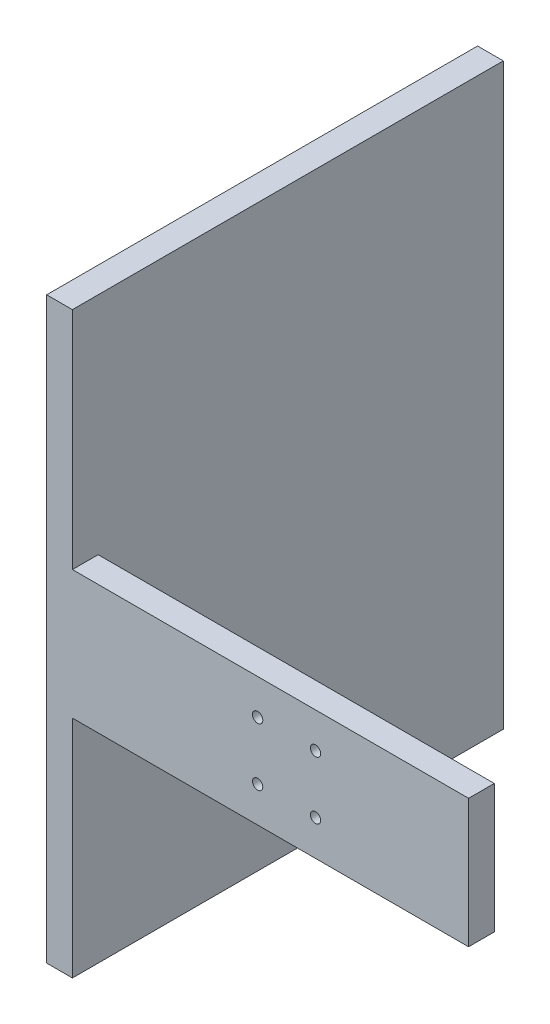
ISO-10303-21;
HEADER;
FILE_DESCRIPTION(('STEP AP214'),'2;1');
FILE_NAME('part.step','',(''),(''),'','','');
FILE_SCHEMA(('AUTOMOTIVE_DESIGN { 1 0 10303 214 1 1 1 1 }'));
ENDSEC;
DATA;
#1=APPLICATION_CONTEXT('core data for automotive mechanical design processes');
#2=APPLICATION_PROTOCOL_DEFINITION('international standard','automotive_design',2000,#1);
#3=PRODUCT_CONTEXT('',#1,'mechanical');
#4=PRODUCT('Part','Part','',(#3));
#5=PRODUCT_RELATED_PRODUCT_CATEGORY('part','',(#4));
#6=PRODUCT_DEFINITION_FORMATION('','',#4);
#7=PRODUCT_DEFINITION_CONTEXT('part definition',#1,'design');
#8=PRODUCT_DEFINITION('design','',#6,#7);
#9=PRODUCT_DEFINITION_SHAPE('','',#8);
#10=(LENGTH_UNIT() NAMED_UNIT(*) SI_UNIT(.MILLI.,.METRE.));
#11=(NAMED_UNIT(*) PLANE_ANGLE_UNIT() SI_UNIT($,.RADIAN.));
#12=(NAMED_UNIT(*) SI_UNIT($,.STERADIAN.) SOLID_ANGLE_UNIT());
#13=UNCERTAINTY_MEASURE_WITH_UNIT(LENGTH_MEASURE(1.E-05),#10,'distance_accuracy_value','');
#14=(GEOMETRIC_REPRESENTATION_CONTEXT(3) GLOBAL_UNCERTAINTY_ASSIGNED_CONTEXT((#13)) GLOBAL_UNIT_ASSIGNED_CONTEXT((#10,
#11,#12)) REPRESENTATION_CONTEXT('',''));
#15=CARTESIAN_POINT('',(0.,0.,0.));
#16=DIRECTION('',(0.,0.,1.));
#17=DIRECTION('',(1.,0.,0.));
#18=AXIS2_PLACEMENT_3D('',#15,#16,#17);
#19=CARTESIAN_POINT('',(-151.1,-10.,32.));
#20=DIRECTION('',(0.,1.,0.));
#21=DIRECTION('',(0.,0.,1.));
#22=AXIS2_PLACEMENT_3D('',#19,#20,#21);
#23=PLANE('',#22);
#24=DIRECTION('',(0.,0.,1.));
#25=VECTOR('',#24,1.);
#26=CARTESIAN_POINT('',(-147.1,-10.,32.));
#27=LINE('',#26,#25);
#28=CARTESIAN_POINT('',(-147.1,-10.,28.));
#29=VERTEX_POINT('',#28);
#30=CARTESIAN_POINT('',(-147.1,-10.,32.));
#31=VERTEX_POINT('',#30);
#32=EDGE_CURVE('E114',#29,#31,#27,.T.);
#33=ORIENTED_EDGE('',*,*,#32,.F.);
#34=DIRECTION('',(1.,0.,0.));
#35=VECTOR('',#34,1.);
#36=CARTESIAN_POINT('',(-151.1,-10.,28.));
#37=LINE('',#36,#35);
#38=CARTESIAN_POINT('',(-85.5,-10.,28.));
#39=VERTEX_POINT('',#38);
#40=EDGE_CURVE('E68',#29,#39,#37,.T.);
#41=ORIENTED_EDGE('',*,*,#40,.T.);
#42=DIRECTION('',(0.,0.,-1.));
#43=VECTOR('',#42,1.);
#44=CARTESIAN_POINT('',(-85.5,-10.,32.));
#45=LINE('',#44,#43);
#46=CARTESIAN_POINT('',(-85.5,-10.,32.));
#47=VERTEX_POINT('',#46);
#48=EDGE_CURVE('E49',#47,#39,#45,.T.);
#49=ORIENTED_EDGE('',*,*,#48,.F.);
#50=DIRECTION('',(1.,0.,0.));
#51=VECTOR('',#50,1.);
#52=CARTESIAN_POINT('',(-151.1,-10.,32.));
#53=LINE('',#52,#51);
#54=EDGE_CURVE('E148',#31,#47,#53,.T.);
#55=ORIENTED_EDGE('',*,*,#54,.F.);
#56=EDGE_LOOP('',(#33,#41,#49,#55));
#57=FACE_BOUND('',#56,.T.);
#58=ADVANCED_FACE('F39',(#57),#23,.F.);
#59=CARTESIAN_POINT('',(-151.1,10.,32.));
#60=DIRECTION('',(0.,-1.,0.));
#61=DIRECTION('',(0.,0.,-1.));
#62=AXIS2_PLACEMENT_3D('',#59,#60,#61);
#63=PLANE('',#62);
#64=DIRECTION('',(0.,0.,-1.));
#65=VECTOR('',#64,1.);
#66=CARTESIAN_POINT('',(-147.1,10.,32.));
#67=LINE('',#66,#65);
#68=CARTESIAN_POINT('',(-147.1,9.99999999999999,32.));
#69=VERTEX_POINT('',#68);
#70=CARTESIAN_POINT('',(-147.1,10.,28.));
#71=VERTEX_POINT('',#70);
#72=EDGE_CURVE('E77',#69,#71,#67,.T.);
#73=ORIENTED_EDGE('',*,*,#72,.F.);
#74=DIRECTION('',(-1.,0.,0.));
#75=VECTOR('',#74,1.);
#76=CARTESIAN_POINT('',(-151.1,10.,32.));
#77=LINE('',#76,#75);
#78=CARTESIAN_POINT('',(-85.5,10.,32.));
#79=VERTEX_POINT('',#78);
#80=EDGE_CURVE('E154',#79,#69,#77,.T.);
#81=ORIENTED_EDGE('',*,*,#80,.F.);
#82=DIRECTION('',(0.,0.,-1.));
#83=VECTOR('',#82,1.);
#84=CARTESIAN_POINT('',(-85.5,10.,32.));
#85=LINE('',#84,#83);
#86=CARTESIAN_POINT('',(-85.5,10.,28.));
#87=VERTEX_POINT('',#86);
#88=EDGE_CURVE('E157',#79,#87,#85,.T.);
#89=ORIENTED_EDGE('',*,*,#88,.T.);
#90=DIRECTION('',(-1.,0.,0.));
#91=VECTOR('',#90,1.);
#92=CARTESIAN_POINT('',(-151.1,10.,28.));
#93=LINE('',#92,#91);
#94=EDGE_CURVE('E149',#87,#71,#93,.T.);
#95=ORIENTED_EDGE('',*,*,#94,.T.);
#96=EDGE_LOOP('',(#73,#81,#89,#95));
#97=FACE_BOUND('',#96,.T.);
#98=ADVANCED_FACE('F176',(#97),#63,.F.);
#99=CARTESIAN_POINT('',(0.,0.,28.));
#100=DIRECTION('',(0.,0.,-1.));
#101=DIRECTION('',(-1.,0.,0.));
#102=AXIS2_PLACEMENT_3D('',#99,#100,#101);
#103=PLANE('',#102);
#104=CARTESIAN_POINT('',(-109.3,-4.5,28.));
#105=DIRECTION('',(0.,0.,1.));
#106=DIRECTION('',(1.,0.,0.));
#107=AXIS2_PLACEMENT_3D('',#104,#105,#106);
#108=CIRCLE('',#107,0.799999999999995);
#109=CARTESIAN_POINT('',(-108.5,-4.5,28.));
#110=VERTEX_POINT('',#109);
#111=EDGE_CURVE('E264',#110,#110,#108,.T.);
#112=ORIENTED_EDGE('',*,*,#111,.T.);
#113=EDGE_LOOP('',(#112));
#114=FACE_BOUND('',#113,.T.);
#115=CARTESIAN_POINT('',(-118.3,4.5,28.));
#116=DIRECTION('',(0.,0.,1.));
#117=DIRECTION('',(1.,0.,0.));
#118=AXIS2_PLACEMENT_3D('',#115,#116,#117);
#119=CIRCLE('',#118,0.799999999999995);
#120=CARTESIAN_POINT('',(-117.5,4.5,28.));
#121=VERTEX_POINT('',#120);
#122=EDGE_CURVE('E258',#121,#121,#119,.T.);
#123=ORIENTED_EDGE('',*,*,#122,.T.);
#124=EDGE_LOOP('',(#123));
#125=FACE_BOUND('',#124,.T.);
#126=CARTESIAN_POINT('',(-118.3,-4.5,28.));
#127=DIRECTION('',(0.,0.,1.));
#128=DIRECTION('',(1.,0.,0.));
#129=AXIS2_PLACEMENT_3D('',#126,#127,#128);
#130=CIRCLE('',#129,0.799999999999995);
#131=CARTESIAN_POINT('',(-117.5,-4.5,28.));
#132=VERTEX_POINT('',#131);
#133=EDGE_CURVE('E270',#132,#132,#130,.T.);
#134=ORIENTED_EDGE('',*,*,#133,.T.);
#135=EDGE_LOOP('',(#134));
#136=FACE_BOUND('',#135,.T.);
#137=CARTESIAN_POINT('',(-109.3,4.5,28.));
#138=DIRECTION('',(0.,0.,1.));
#139=DIRECTION('',(1.,0.,0.));
#140=AXIS2_PLACEMENT_3D('',#137,#138,#139);
#141=CIRCLE('',#140,0.799999999999995);
#142=CARTESIAN_POINT('',(-108.5,4.5,28.));
#143=VERTEX_POINT('',#142);
#144=EDGE_CURVE('E183',#143,#143,#141,.T.);
#145=ORIENTED_EDGE('',*,*,#144,.T.);
#146=EDGE_LOOP('',(#145));
#147=FACE_BOUND('',#146,.T.);
#148=ORIENTED_EDGE('',*,*,#40,.F.);
#149=DIRECTION('',(0.,1.,0.));
#150=VECTOR('',#149,1.);
#151=CARTESIAN_POINT('',(-147.1,0.,28.));
#152=LINE('',#151,#150);
#153=EDGE_CURVE('E11',#29,#71,#152,.T.);
#154=ORIENTED_EDGE('',*,*,#153,.T.);
#155=ORIENTED_EDGE('',*,*,#94,.F.);
#156=DIRECTION('',(0.,1.,0.));
#157=VECTOR('',#156,1.);
#158=CARTESIAN_POINT('',(-85.5,-10.,28.));
#159=LINE('',#158,#157);
#160=EDGE_CURVE('E160',#39,#87,#159,.T.);
#161=ORIENTED_EDGE('',*,*,#160,.F.);
#162=EDGE_LOOP('',(#148,#154,#155,#161));
#163=FACE_BOUND('',#162,.T.);
#164=ADVANCED_FACE('F174',(#114,#125,#136,#147,#163),#103,.T.);
#165=CARTESIAN_POINT('',(-151.1,-10.,32.));
#166=DIRECTION('',(1.,0.,0.));
#167=DIRECTION('',(0.,0.,-1.));
#168=AXIS2_PLACEMENT_3D('',#165,#166,#167);
#169=PLANE('',#168);
#170=CARTESIAN_POINT('',(-151.1,-30.,15.));
#171=DIRECTION('',(1.,0.,0.));
#172=DIRECTION('',(0.,0.,-1.));
#173=AXIS2_PLACEMENT_3D('',#170,#171,#172);
#174=CIRCLE('',#173,0.8);
#175=CARTESIAN_POINT('',(-151.1,-30.,14.2));
#176=VERTEX_POINT('',#175);
#177=EDGE_CURVE('E294',#176,#176,#174,.T.);
#178=ORIENTED_EDGE('',*,*,#177,.T.);
#179=EDGE_LOOP('',(#178));
#180=FACE_BOUND('',#179,.T.);
#181=CARTESIAN_POINT('',(-151.1,30.,-15.));
#182=DIRECTION('',(1.,0.,0.));
#183=DIRECTION('',(0.,0.,-1.));
#184=AXIS2_PLACEMENT_3D('',#181,#182,#183);
#185=CIRCLE('',#184,0.799999999999999);
#186=CARTESIAN_POINT('',(-151.1,30.,-15.8));
#187=VERTEX_POINT('',#186);
#188=EDGE_CURVE('E285',#187,#187,#185,.T.);
#189=ORIENTED_EDGE('',*,*,#188,.T.);
#190=EDGE_LOOP('',(#189));
#191=FACE_BOUND('',#190,.T.);
#192=CARTESIAN_POINT('',(-151.1,30.,15.));
#193=DIRECTION('',(1.,0.,0.));
#194=DIRECTION('',(0.,0.,-1.));
#195=AXIS2_PLACEMENT_3D('',#192,#193,#194);
#196=CIRCLE('',#195,0.8);
#197=CARTESIAN_POINT('',(-151.1,30.,14.2));
#198=VERTEX_POINT('',#197);
#199=EDGE_CURVE('E301',#198,#198,#196,.T.);
#200=ORIENTED_EDGE('',*,*,#199,.T.);
#201=EDGE_LOOP('',(#200));
#202=FACE_BOUND('',#201,.T.);
#203=CARTESIAN_POINT('',(-151.1,-30.,-15.));
#204=DIRECTION('',(1.,0.,0.));
#205=DIRECTION('',(0.,0.,-1.));
#206=AXIS2_PLACEMENT_3D('',#203,#204,#205);
#207=CIRCLE('',#206,0.799999999999999);
#208=CARTESIAN_POINT('',(-151.1,-30.,-15.8));
#209=VERTEX_POINT('',#208);
#210=EDGE_CURVE('E277',#209,#209,#207,.T.);
#211=ORIENTED_EDGE('',*,*,#210,.T.);
#212=EDGE_LOOP('',(#211));
#213=FACE_BOUND('',#212,.T.);
#214=DIRECTION('',(0.,-1.,0.));
#215=VECTOR('',#214,1.);
#216=CARTESIAN_POINT('',(-151.1,-10.,32.));
#217=LINE('',#216,#215);
#218=CARTESIAN_POINT('',(-151.1,45.,32.));
#219=VERTEX_POINT('',#218);
#220=CARTESIAN_POINT('',(-151.1,-45.,32.));
#221=VERTEX_POINT('',#220);
#222=EDGE_CURVE('E133',#219,#221,#217,.T.);
#223=ORIENTED_EDGE('',*,*,#222,.F.);
#224=DIRECTION('',(0.,0.,1.));
#225=VECTOR('',#224,1.);
#226=CARTESIAN_POINT('',(-151.1,45.,32.));
#227=LINE('',#226,#225);
#228=CARTESIAN_POINT('',(-151.1,45.,-35.));
#229=VERTEX_POINT('',#228);
#230=EDGE_CURVE('E119',#229,#219,#227,.T.);
#231=ORIENTED_EDGE('',*,*,#230,.F.);
#232=DIRECTION('',(0.,1.,0.));
#233=VECTOR('',#232,1.);
#234=CARTESIAN_POINT('',(-151.1,-45.,-35.));
#235=LINE('',#234,#233);
#236=CARTESIAN_POINT('',(-151.1,-45.,-35.));
#237=VERTEX_POINT('',#236);
#238=EDGE_CURVE('E194',#237,#229,#235,.T.);
#239=ORIENTED_EDGE('',*,*,#238,.F.);
#240=DIRECTION('',(0.,0.,-1.));
#241=VECTOR('',#240,1.);
#242=CARTESIAN_POINT('',(-151.1,-45.,32.));
#243=LINE('',#242,#241);
#244=EDGE_CURVE('E191',#221,#237,#243,.T.);
#245=ORIENTED_EDGE('',*,*,#244,.F.);
#246=EDGE_LOOP('',(#223,#231,#239,#245));
#247=FACE_BOUND('',#246,.T.);
#248=ADVANCED_FACE('F41',(#180,#191,#202,#213,#247),#169,.F.);
#249=CARTESIAN_POINT('',(-85.5,-10.,32.));
#250=DIRECTION('',(-1.,0.,0.));
#251=DIRECTION('',(0.,0.,1.));
#252=AXIS2_PLACEMENT_3D('',#249,#250,#251);
#253=PLANE('',#252);
#254=ORIENTED_EDGE('',*,*,#160,.T.);
#255=ORIENTED_EDGE('',*,*,#88,.F.);
#256=DIRECTION('',(0.,1.,0.));
#257=VECTOR('',#256,1.);
#258=CARTESIAN_POINT('',(-85.5,-10.,32.));
#259=LINE('',#258,#257);
#260=EDGE_CURVE('E57',#47,#79,#259,.T.);
#261=ORIENTED_EDGE('',*,*,#260,.F.);
#262=ORIENTED_EDGE('',*,*,#48,.T.);
#263=EDGE_LOOP('',(#254,#255,#261,#262));
#264=FACE_BOUND('',#263,.T.);
#265=ADVANCED_FACE('F171',(#264),#253,.F.);
#266=CARTESIAN_POINT('',(0.,0.,32.));
#267=DIRECTION('',(0.,0.,-1.));
#268=DIRECTION('',(-1.,0.,0.));
#269=AXIS2_PLACEMENT_3D('',#266,#267,#268);
#270=PLANE('',#269);
#271=CARTESIAN_POINT('',(-109.3,-4.5,32.));
#272=DIRECTION('',(0.,0.,1.));
#273=DIRECTION('',(1.,0.,0.));
#274=AXIS2_PLACEMENT_3D('',#271,#272,#273);
#275=CIRCLE('',#274,0.799999999999995);
#276=CARTESIAN_POINT('',(-108.5,-4.5,32.));
#277=VERTEX_POINT('',#276);
#278=EDGE_CURVE('E242',#277,#277,#275,.T.);
#279=ORIENTED_EDGE('',*,*,#278,.F.);
#280=EDGE_LOOP('',(#279));
#281=FACE_BOUND('',#280,.T.);
#282=CARTESIAN_POINT('',(-118.3,4.5,32.));
#283=DIRECTION('',(0.,0.,1.));
#284=DIRECTION('',(1.,0.,0.));
#285=AXIS2_PLACEMENT_3D('',#282,#283,#284);
#286=CIRCLE('',#285,0.799999999999995);
#287=CARTESIAN_POINT('',(-117.5,4.5,32.));
#288=VERTEX_POINT('',#287);
#289=EDGE_CURVE('E246',#288,#288,#286,.T.);
#290=ORIENTED_EDGE('',*,*,#289,.F.);
#291=EDGE_LOOP('',(#290));
#292=FACE_BOUND('',#291,.T.);
#293=CARTESIAN_POINT('',(-118.3,-4.5,32.));
#294=DIRECTION('',(0.,0.,1.));
#295=DIRECTION('',(1.,0.,0.));
#296=AXIS2_PLACEMENT_3D('',#293,#294,#295);
#297=CIRCLE('',#296,0.799999999999995);
#298=CARTESIAN_POINT('',(-117.5,-4.5,32.));
#299=VERTEX_POINT('',#298);
#300=EDGE_CURVE('E250',#299,#299,#297,.T.);
#301=ORIENTED_EDGE('',*,*,#300,.F.);
#302=EDGE_LOOP('',(#301));
#303=FACE_BOUND('',#302,.T.);
#304=CARTESIAN_POINT('',(-109.3,4.5,32.));
#305=DIRECTION('',(0.,0.,1.));
#306=DIRECTION('',(1.,0.,0.));
#307=AXIS2_PLACEMENT_3D('',#304,#305,#306);
#308=CIRCLE('',#307,0.799999999999995);
#309=CARTESIAN_POINT('',(-108.5,4.5,32.));
#310=VERTEX_POINT('',#309);
#311=EDGE_CURVE('E195',#310,#310,#308,.T.);
#312=ORIENTED_EDGE('',*,*,#311,.F.);
#313=EDGE_LOOP('',(#312));
#314=FACE_BOUND('',#313,.T.);
#315=ORIENTED_EDGE('',*,*,#222,.T.);
#316=DIRECTION('',(-1.,0.,0.));
#317=VECTOR('',#316,1.);
#318=CARTESIAN_POINT('',(-147.1,-45.,32.));
#319=LINE('',#318,#317);
#320=CARTESIAN_POINT('',(-147.1,-45.,32.));
#321=VERTEX_POINT('',#320);
#322=EDGE_CURVE('E124',#321,#221,#319,.T.);
#323=ORIENTED_EDGE('',*,*,#322,.F.);
#324=DIRECTION('',(0.,-1.,0.));
#325=VECTOR('',#324,1.);
#326=CARTESIAN_POINT('',(-147.1,-45.,32.));
#327=LINE('',#326,#325);
#328=EDGE_CURVE('E109',#31,#321,#327,.T.);
#329=ORIENTED_EDGE('',*,*,#328,.F.);
#330=ORIENTED_EDGE('',*,*,#54,.T.);
#331=ORIENTED_EDGE('',*,*,#260,.T.);
#332=ORIENTED_EDGE('',*,*,#80,.T.);
#333=CARTESIAN_POINT('',(-147.1,45.,32.));
#334=VERTEX_POINT('',#333);
#335=EDGE_CURVE('E118',#334,#69,#327,.T.);
#336=ORIENTED_EDGE('',*,*,#335,.F.);
#337=DIRECTION('',(-1.,0.,0.));
#338=VECTOR('',#337,1.);
#339=CARTESIAN_POINT('',(-147.1,45.,32.));
#340=LINE('',#339,#338);
#341=EDGE_CURVE('E180',#334,#219,#340,.T.);
#342=ORIENTED_EDGE('',*,*,#341,.T.);
#343=EDGE_LOOP('',(#315,#323,#329,#330,#331,#332,#336,#342));
#344=FACE_BOUND('',#343,.T.);
#345=ADVANCED_FACE('F131',(#281,#292,#303,#314,#344),#270,.F.);
#346=CARTESIAN_POINT('',(-147.1,0.,0.));
#347=DIRECTION('',(-1.,0.,0.));
#348=DIRECTION('',(0.,0.,1.));
#349=AXIS2_PLACEMENT_3D('',#346,#347,#348);
#350=PLANE('',#349);
#351=ORIENTED_EDGE('',*,*,#153,.F.);
#352=ORIENTED_EDGE('',*,*,#32,.T.);
#353=ORIENTED_EDGE('',*,*,#328,.T.);
#354=DIRECTION('',(0.,0.,-1.));
#355=VECTOR('',#354,1.);
#356=CARTESIAN_POINT('',(-147.1,-45.,32.));
#357=LINE('',#356,#355);
#358=CARTESIAN_POINT('',(-147.1,-45.,-35.));
#359=VERTEX_POINT('',#358);
#360=EDGE_CURVE('E112',#321,#359,#357,.T.);
#361=ORIENTED_EDGE('',*,*,#360,.T.);
#362=DIRECTION('',(0.,1.,0.));
#363=VECTOR('',#362,1.);
#364=CARTESIAN_POINT('',(-147.1,-45.,-35.));
#365=LINE('',#364,#363);
#366=CARTESIAN_POINT('',(-147.1,45.,-35.));
#367=VERTEX_POINT('',#366);
#368=EDGE_CURVE('E129',#359,#367,#365,.T.);
#369=ORIENTED_EDGE('',*,*,#368,.T.);
#370=DIRECTION('',(0.,0.,1.));
#371=VECTOR('',#370,1.);
#372=CARTESIAN_POINT('',(-147.1,45.,32.));
#373=LINE('',#372,#371);
#374=EDGE_CURVE('E188',#367,#334,#373,.T.);
#375=ORIENTED_EDGE('',*,*,#374,.T.);
#376=ORIENTED_EDGE('',*,*,#335,.T.);
#377=ORIENTED_EDGE('',*,*,#72,.T.);
#378=EDGE_LOOP('',(#351,#352,#353,#361,#369,#375,#376,#377));
#379=FACE_BOUND('',#378,.T.);
#380=ADVANCED_FACE('F111',(#379),#350,.F.);
#381=CARTESIAN_POINT('',(-147.1,-45.,32.));
#382=DIRECTION('',(0.,1.,0.));
#383=DIRECTION('',(0.,0.,1.));
#384=AXIS2_PLACEMENT_3D('',#381,#382,#383);
#385=PLANE('',#384);
#386=ORIENTED_EDGE('',*,*,#244,.T.);
#387=DIRECTION('',(-1.,0.,0.));
#388=VECTOR('',#387,1.);
#389=CARTESIAN_POINT('',(-147.1,-45.,-35.));
#390=LINE('',#389,#388);
#391=EDGE_CURVE('E126',#359,#237,#390,.T.);
#392=ORIENTED_EDGE('',*,*,#391,.F.);
#393=ORIENTED_EDGE('',*,*,#360,.F.);
#394=ORIENTED_EDGE('',*,*,#322,.T.);
#395=EDGE_LOOP('',(#386,#392,#393,#394));
#396=FACE_BOUND('',#395,.T.);
#397=ADVANCED_FACE('F123',(#396),#385,.F.);
#398=CARTESIAN_POINT('',(-147.1,-45.,-35.));
#399=DIRECTION('',(0.,0.,1.));
#400=DIRECTION('',(1.,0.,0.));
#401=AXIS2_PLACEMENT_3D('',#398,#399,#400);
#402=PLANE('',#401);
#403=ORIENTED_EDGE('',*,*,#238,.T.);
#404=DIRECTION('',(-1.,0.,0.));
#405=VECTOR('',#404,1.);
#406=CARTESIAN_POINT('',(-147.1,45.,-35.));
#407=LINE('',#406,#405);
#408=EDGE_CURVE('E140',#367,#229,#407,.T.);
#409=ORIENTED_EDGE('',*,*,#408,.F.);
#410=ORIENTED_EDGE('',*,*,#368,.F.);
#411=ORIENTED_EDGE('',*,*,#391,.T.);
#412=EDGE_LOOP('',(#403,#409,#410,#411));
#413=FACE_BOUND('',#412,.T.);
#414=ADVANCED_FACE('F212',(#413),#402,.F.);
#415=CARTESIAN_POINT('',(-147.1,45.,32.));
#416=DIRECTION('',(0.,-1.,0.));
#417=DIRECTION('',(0.,0.,-1.));
#418=AXIS2_PLACEMENT_3D('',#415,#416,#417);
#419=PLANE('',#418);
#420=ORIENTED_EDGE('',*,*,#230,.T.);
#421=ORIENTED_EDGE('',*,*,#341,.F.);
#422=ORIENTED_EDGE('',*,*,#374,.F.);
#423=ORIENTED_EDGE('',*,*,#408,.T.);
#424=EDGE_LOOP('',(#420,#421,#422,#423));
#425=FACE_BOUND('',#424,.T.);
#426=ADVANCED_FACE('F208',(#425),#419,.F.);
#427=CARTESIAN_POINT('',(-109.3,4.5,32.));
#428=DIRECTION('',(0.,0.,-1.));
#429=DIRECTION('',(-1.,0.,0.));
#430=AXIS2_PLACEMENT_3D('',#427,#428,#429);
#431=CYLINDRICAL_SURFACE('',#430,0.799999999999995);
#432=ORIENTED_EDGE('',*,*,#311,.T.);
#433=EDGE_LOOP('',(#432));
#434=FACE_BOUND('',#433,.T.);
#435=ORIENTED_EDGE('',*,*,#144,.F.);
#436=EDGE_LOOP('',(#435));
#437=FACE_BOUND('',#436,.T.);
#438=ADVANCED_FACE('F219',(#434,#437),#431,.F.);
#439=CARTESIAN_POINT('',(-118.3,-4.5,32.));
#440=DIRECTION('',(0.,0.,-1.));
#441=DIRECTION('',(-1.,0.,0.));
#442=AXIS2_PLACEMENT_3D('',#439,#440,#441);
#443=CYLINDRICAL_SURFACE('',#442,0.799999999999995);
#444=ORIENTED_EDGE('',*,*,#300,.T.);
#445=EDGE_LOOP('',(#444));
#446=FACE_BOUND('',#445,.T.);
#447=ORIENTED_EDGE('',*,*,#133,.F.);
#448=EDGE_LOOP('',(#447));
#449=FACE_BOUND('',#448,.T.);
#450=ADVANCED_FACE('F345',(#446,#449),#443,.F.);
#451=CARTESIAN_POINT('',(-118.3,4.5,32.));
#452=DIRECTION('',(0.,0.,-1.));
#453=DIRECTION('',(-1.,0.,0.));
#454=AXIS2_PLACEMENT_3D('',#451,#452,#453);
#455=CYLINDRICAL_SURFACE('',#454,0.799999999999995);
#456=ORIENTED_EDGE('',*,*,#289,.T.);
#457=EDGE_LOOP('',(#456));
#458=FACE_BOUND('',#457,.T.);
#459=ORIENTED_EDGE('',*,*,#122,.F.);
#460=EDGE_LOOP('',(#459));
#461=FACE_BOUND('',#460,.T.);
#462=ADVANCED_FACE('F348',(#458,#461),#455,.F.);
#463=CARTESIAN_POINT('',(-109.3,-4.5,32.));
#464=DIRECTION('',(0.,0.,-1.));
#465=DIRECTION('',(-1.,0.,0.));
#466=AXIS2_PLACEMENT_3D('',#463,#464,#465);
#467=CYLINDRICAL_SURFACE('',#466,0.799999999999995);
#468=ORIENTED_EDGE('',*,*,#278,.T.);
#469=EDGE_LOOP('',(#468));
#470=FACE_BOUND('',#469,.T.);
#471=ORIENTED_EDGE('',*,*,#111,.F.);
#472=EDGE_LOOP('',(#471));
#473=FACE_BOUND('',#472,.T.);
#474=ADVANCED_FACE('F343',(#470,#473),#467,.F.);
#475=CARTESIAN_POINT('',(-147.6,-30.,-15.));
#476=DIRECTION('',(-1.,0.,0.));
#477=DIRECTION('',(0.,0.,1.));
#478=AXIS2_PLACEMENT_3D('',#475,#476,#477);
#479=CYLINDRICAL_SURFACE('',#478,0.799999999999999);
#480=CARTESIAN_POINT('',(-147.6,-30.,-15.));
#481=DIRECTION('',(1.,0.,0.));
#482=DIRECTION('',(0.,0.,-1.));
#483=AXIS2_PLACEMENT_3D('',#480,#481,#482);
#484=CIRCLE('',#483,0.799999999999999);
#485=CARTESIAN_POINT('',(-147.6,-30.,-15.8));
#486=VERTEX_POINT('',#485);
#487=EDGE_CURVE('E274',#486,#486,#484,.T.);
#488=ORIENTED_EDGE('',*,*,#487,.T.);
#489=EDGE_LOOP('',(#488));
#490=FACE_BOUND('',#489,.T.);
#491=ORIENTED_EDGE('',*,*,#210,.F.);
#492=EDGE_LOOP('',(#491));
#493=FACE_BOUND('',#492,.T.);
#494=ADVANCED_FACE('F339',(#490,#493),#479,.F.);
#495=CARTESIAN_POINT('',(-147.6,-30.,-15.));
#496=DIRECTION('',(1.,0.,0.));
#497=DIRECTION('',(0.,0.,-1.));
#498=AXIS2_PLACEMENT_3D('',#495,#496,#497);
#499=PLANE('',#498);
#500=ORIENTED_EDGE('',*,*,#487,.F.);
#501=EDGE_LOOP('',(#500));
#502=FACE_BOUND('',#501,.T.);
#503=ADVANCED_FACE('F323',(#502),#499,.F.);
#504=CARTESIAN_POINT('',(-147.6,30.,15.));
#505=DIRECTION('',(-1.,0.,0.));
#506=DIRECTION('',(0.,0.,1.));
#507=AXIS2_PLACEMENT_3D('',#504,#505,#506);
#508=CYLINDRICAL_SURFACE('',#507,0.8);
#509=CARTESIAN_POINT('',(-147.6,30.,15.));
#510=DIRECTION('',(1.,0.,0.));
#511=DIRECTION('',(0.,0.,-1.));
#512=AXIS2_PLACEMENT_3D('',#509,#510,#511);
#513=CIRCLE('',#512,0.8);
#514=CARTESIAN_POINT('',(-147.6,30.,14.2));
#515=VERTEX_POINT('',#514);
#516=EDGE_CURVE('E290',#515,#515,#513,.T.);
#517=ORIENTED_EDGE('',*,*,#516,.T.);
#518=EDGE_LOOP('',(#517));
#519=FACE_BOUND('',#518,.T.);
#520=ORIENTED_EDGE('',*,*,#199,.F.);
#521=EDGE_LOOP('',(#520));
#522=FACE_BOUND('',#521,.T.);
#523=ADVANCED_FACE('F309',(#519,#522),#508,.F.);
#524=CARTESIAN_POINT('',(-147.6,30.,15.));
#525=DIRECTION('',(1.,0.,0.));
#526=DIRECTION('',(0.,0.,-1.));
#527=AXIS2_PLACEMENT_3D('',#524,#525,#526);
#528=PLANE('',#527);
#529=ORIENTED_EDGE('',*,*,#516,.F.);
#530=EDGE_LOOP('',(#529));
#531=FACE_BOUND('',#530,.T.);
#532=ADVANCED_FACE('F312',(#531),#528,.F.);
#533=CARTESIAN_POINT('',(-147.6,30.,-15.));
#534=DIRECTION('',(-1.,0.,0.));
#535=DIRECTION('',(0.,0.,1.));
#536=AXIS2_PLACEMENT_3D('',#533,#534,#535);
#537=CYLINDRICAL_SURFACE('',#536,0.799999999999999);
#538=CARTESIAN_POINT('',(-147.6,30.,-15.));
#539=DIRECTION('',(1.,0.,0.));
#540=DIRECTION('',(0.,0.,-1.));
#541=AXIS2_PLACEMENT_3D('',#538,#539,#540);
#542=CIRCLE('',#541,0.799999999999999);
#543=CARTESIAN_POINT('',(-147.6,30.,-15.8));
#544=VERTEX_POINT('',#543);
#545=EDGE_CURVE('E289',#544,#544,#542,.T.);
#546=ORIENTED_EDGE('',*,*,#545,.T.);
#547=EDGE_LOOP('',(#546));
#548=FACE_BOUND('',#547,.T.);
#549=ORIENTED_EDGE('',*,*,#188,.F.);
#550=EDGE_LOOP('',(#549));
#551=FACE_BOUND('',#550,.T.);
#552=ADVANCED_FACE('F314',(#548,#551),#537,.F.);
#553=CARTESIAN_POINT('',(-147.6,30.,-15.));
#554=DIRECTION('',(1.,0.,0.));
#555=DIRECTION('',(0.,0.,-1.));
#556=AXIS2_PLACEMENT_3D('',#553,#554,#555);
#557=PLANE('',#556);
#558=ORIENTED_EDGE('',*,*,#545,.F.);
#559=EDGE_LOOP('',(#558));
#560=FACE_BOUND('',#559,.T.);
#561=ADVANCED_FACE('F320',(#560),#557,.F.);
#562=CARTESIAN_POINT('',(-147.6,-30.,15.));
#563=DIRECTION('',(-1.,0.,0.));
#564=DIRECTION('',(0.,0.,1.));
#565=AXIS2_PLACEMENT_3D('',#562,#563,#564);
#566=CYLINDRICAL_SURFACE('',#565,0.8);
#567=CARTESIAN_POINT('',(-147.6,-30.,15.));
#568=DIRECTION('',(1.,0.,0.));
#569=DIRECTION('',(0.,0.,-1.));
#570=AXIS2_PLACEMENT_3D('',#567,#568,#569);
#571=CIRCLE('',#570,0.8);
#572=CARTESIAN_POINT('',(-147.6,-30.,14.2));
#573=VERTEX_POINT('',#572);
#574=EDGE_CURVE('E281',#573,#573,#571,.T.);
#575=ORIENTED_EDGE('',*,*,#574,.T.);
#576=EDGE_LOOP('',(#575));
#577=FACE_BOUND('',#576,.T.);
#578=ORIENTED_EDGE('',*,*,#177,.F.);
#579=EDGE_LOOP('',(#578));
#580=FACE_BOUND('',#579,.T.);
#581=ADVANCED_FACE('F329',(#577,#580),#566,.F.);
#582=CARTESIAN_POINT('',(-147.6,-30.,15.));
#583=DIRECTION('',(1.,0.,0.));
#584=DIRECTION('',(0.,0.,-1.));
#585=AXIS2_PLACEMENT_3D('',#582,#583,#584);
#586=PLANE('',#585);
#587=ORIENTED_EDGE('',*,*,#574,.F.);
#588=EDGE_LOOP('',(#587));
#589=FACE_BOUND('',#588,.T.);
#590=ADVANCED_FACE('F326',(#589),#586,.F.);
#591=CLOSED_SHELL('',(#58,#98,#164,#248,#265,#345,#380,#397,#414,#426,#438,#450,#462,#474,#494,
#503,#523,#532,#552,#561,#581,#590));
#592=MANIFOLD_SOLID_BREP('B2',#591);
#593=ADVANCED_BREP_SHAPE_REPRESENTATION('',(#18,#592),#14);
#594=SHAPE_DEFINITION_REPRESENTATION(#9,#593);
ENDSEC;
END-ISO-10303-21;
